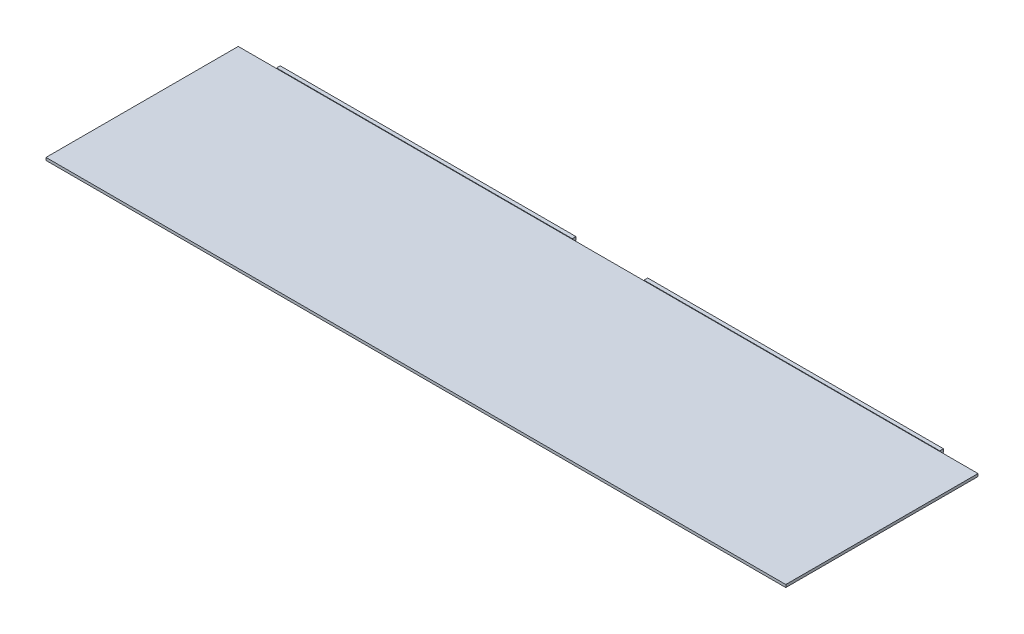
ISO-10303-21;
HEADER;
FILE_DESCRIPTION(('STEP AP214'),'2;1');
FILE_NAME('part.step','',(''),(''),'','','');
FILE_SCHEMA(('AUTOMOTIVE_DESIGN { 1 0 10303 214 1 1 1 1 }'));
ENDSEC;
DATA;
#1=APPLICATION_CONTEXT('core data for automotive mechanical design processes');
#2=APPLICATION_PROTOCOL_DEFINITION('international standard','automotive_design',2000,#1);
#3=PRODUCT_CONTEXT('',#1,'mechanical');
#4=PRODUCT('Part','Part','',(#3));
#5=PRODUCT_RELATED_PRODUCT_CATEGORY('part','',(#4));
#6=PRODUCT_DEFINITION_FORMATION('','',#4);
#7=PRODUCT_DEFINITION_CONTEXT('part definition',#1,'design');
#8=PRODUCT_DEFINITION('design','',#6,#7);
#9=PRODUCT_DEFINITION_SHAPE('','',#8);
#10=(LENGTH_UNIT() NAMED_UNIT(*) SI_UNIT(.MILLI.,.METRE.));
#11=(NAMED_UNIT(*) PLANE_ANGLE_UNIT() SI_UNIT($,.RADIAN.));
#12=(NAMED_UNIT(*) SI_UNIT($,.STERADIAN.) SOLID_ANGLE_UNIT());
#13=UNCERTAINTY_MEASURE_WITH_UNIT(LENGTH_MEASURE(1.E-05),#10,'distance_accuracy_value','');
#14=(GEOMETRIC_REPRESENTATION_CONTEXT(3) GLOBAL_UNCERTAINTY_ASSIGNED_CONTEXT((#13)) GLOBAL_UNIT_ASSIGNED_CONTEXT((#10,
#11,#12)) REPRESENTATION_CONTEXT('',''));
#15=CARTESIAN_POINT('',(0.,0.,0.));
#16=DIRECTION('',(0.,0.,1.));
#17=DIRECTION('',(1.,0.,0.));
#18=AXIS2_PLACEMENT_3D('',#15,#16,#17);
#19=CARTESIAN_POINT('',(-317.6778,1.143,-82.55));
#20=DIRECTION('',(0.,0.,1.));
#21=DIRECTION('',(1.,0.,0.));
#22=AXIS2_PLACEMENT_3D('',#19,#20,#21);
#23=PLANE('',#22);
#24=DIRECTION('',(0.,-1.,0.));
#25=VECTOR('',#24,1.);
#26=CARTESIAN_POINT('',(284.822900000001,-1.143,-82.55));
#27=LINE('',#26,#25);
#28=CARTESIAN_POINT('',(284.822900000001,1.143,-82.55));
#29=VERTEX_POINT('',#28);
#30=CARTESIAN_POINT('',(284.822900000001,-1.143,-82.55));
#31=VERTEX_POINT('',#30);
#32=EDGE_CURVE('E58',#29,#31,#27,.T.);
#33=ORIENTED_EDGE('',*,*,#32,.F.);
#34=DIRECTION('',(-1.,0.,0.));
#35=VECTOR('',#34,1.);
#36=CARTESIAN_POINT('',(-317.6778,1.143,-82.55));
#37=LINE('',#36,#35);
#38=CARTESIAN_POINT('',(317.6778,1.143,-82.55));
#39=VERTEX_POINT('',#38);
#40=EDGE_CURVE('E203',#39,#29,#37,.T.);
#41=ORIENTED_EDGE('',*,*,#40,.F.);
#42=DIRECTION('',(0.,-1.,0.));
#43=VECTOR('',#42,1.);
#44=CARTESIAN_POINT('',(317.6778,1.143,-82.55));
#45=LINE('',#44,#43);
#46=CARTESIAN_POINT('',(317.6778,-1.143,-82.55));
#47=VERTEX_POINT('',#46);
#48=EDGE_CURVE('E37',#39,#47,#45,.T.);
#49=ORIENTED_EDGE('',*,*,#48,.T.);
#50=DIRECTION('',(-1.,0.,0.));
#51=VECTOR('',#50,1.);
#52=CARTESIAN_POINT('',(-317.6778,-1.143,-82.55));
#53=LINE('',#52,#51);
#54=EDGE_CURVE('E214',#47,#31,#53,.T.);
#55=ORIENTED_EDGE('',*,*,#54,.T.);
#56=EDGE_LOOP('',(#33,#41,#49,#55));
#57=FACE_BOUND('',#56,.T.);
#58=ADVANCED_FACE('F33',(#57),#23,.F.);
#59=DIRECTION('',(0.,1.,0.));
#60=VECTOR('',#59,1.);
#61=CARTESIAN_POINT('',(30.8229000000015,1.58749999999994,-82.55));
#62=LINE('',#61,#60);
#63=CARTESIAN_POINT('',(30.8229000000015,-1.143,-82.55));
#64=VERTEX_POINT('',#63);
#65=CARTESIAN_POINT('',(30.8229000000014,1.143,-82.55));
#66=VERTEX_POINT('',#65);
#67=EDGE_CURVE('E252',#64,#66,#62,.T.);
#68=ORIENTED_EDGE('',*,*,#67,.F.);
#69=CARTESIAN_POINT('',(-30.8229000000015,-1.143,-82.55));
#70=VERTEX_POINT('',#69);
#71=EDGE_CURVE('E217',#64,#70,#53,.T.);
#72=ORIENTED_EDGE('',*,*,#71,.T.);
#73=DIRECTION('',(0.,-1.,0.));
#74=VECTOR('',#73,1.);
#75=CARTESIAN_POINT('',(-30.8229000000015,-1.143,-82.55));
#76=LINE('',#75,#74);
#77=CARTESIAN_POINT('',(-30.8229000000015,1.143,-82.55));
#78=VERTEX_POINT('',#77);
#79=EDGE_CURVE('E11',#78,#70,#76,.T.);
#80=ORIENTED_EDGE('',*,*,#79,.F.);
#81=EDGE_CURVE('E50',#66,#78,#37,.T.);
#82=ORIENTED_EDGE('',*,*,#81,.F.);
#83=EDGE_LOOP('',(#68,#72,#80,#82));
#84=FACE_BOUND('',#83,.T.);
#85=ADVANCED_FACE('F250',(#84),#23,.F.);
#86=DIRECTION('',(0.,1.,0.));
#87=VECTOR('',#86,1.);
#88=CARTESIAN_POINT('',(-284.822900000001,1.58749999999994,-82.55));
#89=LINE('',#88,#87);
#90=CARTESIAN_POINT('',(-284.822900000001,-1.143,-82.55));
#91=VERTEX_POINT('',#90);
#92=CARTESIAN_POINT('',(-284.822900000001,1.143,-82.55));
#93=VERTEX_POINT('',#92);
#94=EDGE_CURVE('E182',#91,#93,#89,.T.);
#95=ORIENTED_EDGE('',*,*,#94,.F.);
#96=CARTESIAN_POINT('',(-317.6778,-1.143,-82.55));
#97=VERTEX_POINT('',#96);
#98=EDGE_CURVE('E213',#91,#97,#53,.T.);
#99=ORIENTED_EDGE('',*,*,#98,.T.);
#100=DIRECTION('',(0.,-1.,0.));
#101=VECTOR('',#100,1.);
#102=CARTESIAN_POINT('',(-317.6778,1.143,-82.55));
#103=LINE('',#102,#101);
#104=CARTESIAN_POINT('',(-317.6778,1.143,-82.55));
#105=VERTEX_POINT('',#104);
#106=EDGE_CURVE('E224',#105,#97,#103,.T.);
#107=ORIENTED_EDGE('',*,*,#106,.F.);
#108=EDGE_CURVE('E201',#93,#105,#37,.T.);
#109=ORIENTED_EDGE('',*,*,#108,.F.);
#110=EDGE_LOOP('',(#95,#99,#107,#109));
#111=FACE_BOUND('',#110,.T.);
#112=ADVANCED_FACE('F248',(#111),#23,.F.);
#113=CARTESIAN_POINT('',(317.6778,1.143,-82.55));
#114=DIRECTION('',(-1.,0.,0.));
#115=DIRECTION('',(0.,0.,1.));
#116=AXIS2_PLACEMENT_3D('',#113,#114,#115);
#117=PLANE('',#116);
#118=DIRECTION('',(0.,0.,-1.));
#119=VECTOR('',#118,1.);
#120=CARTESIAN_POINT('',(317.6778,-1.143,-82.55));
#121=LINE('',#120,#119);
#122=CARTESIAN_POINT('',(317.6778,-1.143,82.55));
#123=VERTEX_POINT('',#122);
#124=EDGE_CURVE('E197',#123,#47,#121,.T.);
#125=ORIENTED_EDGE('',*,*,#124,.T.);
#126=ORIENTED_EDGE('',*,*,#48,.F.);
#127=DIRECTION('',(0.,0.,-1.));
#128=VECTOR('',#127,1.);
#129=CARTESIAN_POINT('',(317.6778,1.143,-82.55));
#130=LINE('',#129,#128);
#131=CARTESIAN_POINT('',(317.6778,1.143,82.55));
#132=VERTEX_POINT('',#131);
#133=EDGE_CURVE('E198',#132,#39,#130,.T.);
#134=ORIENTED_EDGE('',*,*,#133,.F.);
#135=DIRECTION('',(0.,-1.,0.));
#136=VECTOR('',#135,1.);
#137=CARTESIAN_POINT('',(317.6778,1.143,82.55));
#138=LINE('',#137,#136);
#139=EDGE_CURVE('E210',#132,#123,#138,.T.);
#140=ORIENTED_EDGE('',*,*,#139,.T.);
#141=EDGE_LOOP('',(#125,#126,#134,#140));
#142=FACE_BOUND('',#141,.T.);
#143=ADVANCED_FACE('F35',(#142),#117,.F.);
#144=CARTESIAN_POINT('',(-317.6778,1.143,-82.55));
#145=DIRECTION('',(1.,0.,0.));
#146=DIRECTION('',(0.,0.,-1.));
#147=AXIS2_PLACEMENT_3D('',#144,#145,#146);
#148=PLANE('',#147);
#149=DIRECTION('',(0.,0.,1.));
#150=VECTOR('',#149,1.);
#151=CARTESIAN_POINT('',(-317.6778,-1.143,-82.55));
#152=LINE('',#151,#150);
#153=CARTESIAN_POINT('',(-317.6778,-1.143,82.55));
#154=VERTEX_POINT('',#153);
#155=EDGE_CURVE('E216',#97,#154,#152,.T.);
#156=ORIENTED_EDGE('',*,*,#155,.T.);
#157=DIRECTION('',(0.,-1.,0.));
#158=VECTOR('',#157,1.);
#159=CARTESIAN_POINT('',(-317.6778,1.143,82.55));
#160=LINE('',#159,#158);
#161=CARTESIAN_POINT('',(-317.6778,1.143,82.55));
#162=VERTEX_POINT('',#161);
#163=EDGE_CURVE('E222',#162,#154,#160,.T.);
#164=ORIENTED_EDGE('',*,*,#163,.F.);
#165=DIRECTION('',(0.,0.,1.));
#166=VECTOR('',#165,1.);
#167=CARTESIAN_POINT('',(-317.6778,1.143,-82.55));
#168=LINE('',#167,#166);
#169=EDGE_CURVE('E205',#105,#162,#168,.T.);
#170=ORIENTED_EDGE('',*,*,#169,.F.);
#171=ORIENTED_EDGE('',*,*,#106,.T.);
#172=EDGE_LOOP('',(#156,#164,#170,#171));
#173=FACE_BOUND('',#172,.T.);
#174=ADVANCED_FACE('F241',(#173),#148,.F.);
#175=CARTESIAN_POINT('',(-317.6778,1.143,82.55));
#176=DIRECTION('',(0.,0.,-1.));
#177=DIRECTION('',(-1.,0.,0.));
#178=AXIS2_PLACEMENT_3D('',#175,#176,#177);
#179=PLANE('',#178);
#180=DIRECTION('',(1.,0.,0.));
#181=VECTOR('',#180,1.);
#182=CARTESIAN_POINT('',(-317.6778,-1.143,82.55));
#183=LINE('',#182,#181);
#184=EDGE_CURVE('E202',#154,#123,#183,.T.);
#185=ORIENTED_EDGE('',*,*,#184,.T.);
#186=ORIENTED_EDGE('',*,*,#139,.F.);
#187=DIRECTION('',(1.,0.,0.));
#188=VECTOR('',#187,1.);
#189=CARTESIAN_POINT('',(-317.6778,1.143,82.55));
#190=LINE('',#189,#188);
#191=EDGE_CURVE('E208',#162,#132,#190,.T.);
#192=ORIENTED_EDGE('',*,*,#191,.F.);
#193=ORIENTED_EDGE('',*,*,#163,.T.);
#194=EDGE_LOOP('',(#185,#186,#192,#193));
#195=FACE_BOUND('',#194,.T.);
#196=ADVANCED_FACE('F238',(#195),#179,.F.);
#197=CARTESIAN_POINT('',(0.,1.143,0.));
#198=DIRECTION('',(0.,1.,0.));
#199=DIRECTION('',(0.,0.,1.));
#200=AXIS2_PLACEMENT_3D('',#197,#198,#199);
#201=PLANE('',#200);
#202=ORIENTED_EDGE('',*,*,#133,.T.);
#203=ORIENTED_EDGE('',*,*,#40,.T.);
#204=DIRECTION('',(1.,0.,0.));
#205=VECTOR('',#204,1.);
#206=CARTESIAN_POINT('',(0.,1.143,-82.55));
#207=LINE('',#206,#205);
#208=EDGE_CURVE('E161',#66,#29,#207,.T.);
#209=ORIENTED_EDGE('',*,*,#208,.F.);
#210=ORIENTED_EDGE('',*,*,#81,.T.);
#211=EDGE_CURVE('E206',#78,#93,#37,.T.);
#212=ORIENTED_EDGE('',*,*,#211,.T.);
#213=ORIENTED_EDGE('',*,*,#108,.T.);
#214=ORIENTED_EDGE('',*,*,#169,.T.);
#215=ORIENTED_EDGE('',*,*,#191,.T.);
#216=EDGE_LOOP('',(#202,#203,#209,#210,#212,#213,#214,#215));
#217=FACE_BOUND('',#216,.T.);
#218=ADVANCED_FACE('F243',(#217),#201,.T.);
#219=CARTESIAN_POINT('',(0.,-1.143,0.));
#220=DIRECTION('',(0.,1.,0.));
#221=DIRECTION('',(0.,0.,1.));
#222=AXIS2_PLACEMENT_3D('',#219,#220,#221);
#223=PLANE('',#222);
#224=ORIENTED_EDGE('',*,*,#124,.F.);
#225=ORIENTED_EDGE('',*,*,#184,.F.);
#226=ORIENTED_EDGE('',*,*,#155,.F.);
#227=ORIENTED_EDGE('',*,*,#98,.F.);
#228=DIRECTION('',(0.,0.,1.));
#229=VECTOR('',#228,1.);
#230=CARTESIAN_POINT('',(-284.822900000001,-1.143,-85.725));
#231=LINE('',#230,#229);
#232=CARTESIAN_POINT('',(-284.822900000001,-1.143,-85.725));
#233=VERTEX_POINT('',#232);
#234=EDGE_CURVE('E191',#233,#91,#231,.T.);
#235=ORIENTED_EDGE('',*,*,#234,.F.);
#236=DIRECTION('',(-1.,0.,0.));
#237=VECTOR('',#236,1.);
#238=CARTESIAN_POINT('',(-30.8229000000015,-1.143,-85.725));
#239=LINE('',#238,#237);
#240=CARTESIAN_POINT('',(-30.8229000000015,-1.143,-85.725));
#241=VERTEX_POINT('',#240);
#242=EDGE_CURVE('E172',#241,#233,#239,.T.);
#243=ORIENTED_EDGE('',*,*,#242,.F.);
#244=DIRECTION('',(0.,0.,1.));
#245=VECTOR('',#244,1.);
#246=CARTESIAN_POINT('',(-30.8229000000015,-1.143,-85.725));
#247=LINE('',#246,#245);
#248=EDGE_CURVE('E194',#241,#70,#247,.T.);
#249=ORIENTED_EDGE('',*,*,#248,.T.);
#250=ORIENTED_EDGE('',*,*,#71,.F.);
#251=DIRECTION('',(0.,0.,1.));
#252=VECTOR('',#251,1.);
#253=CARTESIAN_POINT('',(30.8229000000015,-1.143,-85.725));
#254=LINE('',#253,#252);
#255=CARTESIAN_POINT('',(30.8229000000015,-1.143,-85.725));
#256=VERTEX_POINT('',#255);
#257=EDGE_CURVE('E144',#256,#64,#254,.T.);
#258=ORIENTED_EDGE('',*,*,#257,.F.);
#259=DIRECTION('',(-1.,0.,0.));
#260=VECTOR('',#259,1.);
#261=CARTESIAN_POINT('',(284.822900000001,-1.143,-85.725));
#262=LINE('',#261,#260);
#263=CARTESIAN_POINT('',(284.822900000001,-1.143,-85.725));
#264=VERTEX_POINT('',#263);
#265=EDGE_CURVE('E137',#264,#256,#262,.T.);
#266=ORIENTED_EDGE('',*,*,#265,.F.);
#267=DIRECTION('',(0.,0.,1.));
#268=VECTOR('',#267,1.);
#269=CARTESIAN_POINT('',(284.822900000001,-1.143,-85.725));
#270=LINE('',#269,#268);
#271=EDGE_CURVE('E142',#264,#31,#270,.T.);
#272=ORIENTED_EDGE('',*,*,#271,.T.);
#273=ORIENTED_EDGE('',*,*,#54,.F.);
#274=EDGE_LOOP('',(#224,#225,#226,#227,#235,#243,#249,#250,#258,#266,#272,#273));
#275=FACE_BOUND('',#274,.T.);
#276=ADVANCED_FACE('F140',(#275),#223,.F.);
#277=CARTESIAN_POINT('',(0.,0.,-82.55));
#278=DIRECTION('',(0.,0.,1.));
#279=DIRECTION('',(1.,0.,0.));
#280=AXIS2_PLACEMENT_3D('',#277,#278,#279);
#281=PLANE('',#280);
#282=ORIENTED_EDGE('',*,*,#211,.F.);
#283=CARTESIAN_POINT('',(-30.8229000000015,1.58749999999994,-82.55));
#284=VERTEX_POINT('',#283);
#285=EDGE_CURVE('E43',#284,#78,#76,.T.);
#286=ORIENTED_EDGE('',*,*,#285,.F.);
#287=DIRECTION('',(1.,0.,0.));
#288=VECTOR('',#287,1.);
#289=CARTESIAN_POINT('',(-30.8229000000015,1.58749999999994,-82.55));
#290=LINE('',#289,#288);
#291=CARTESIAN_POINT('',(-284.822900000001,1.58749999999994,-82.55));
#292=VERTEX_POINT('',#291);
#293=EDGE_CURVE('E173',#292,#284,#290,.T.);
#294=ORIENTED_EDGE('',*,*,#293,.F.);
#295=EDGE_CURVE('E181',#93,#292,#89,.T.);
#296=ORIENTED_EDGE('',*,*,#295,.F.);
#297=EDGE_LOOP('',(#282,#286,#294,#296));
#298=FACE_BOUND('',#297,.T.);
#299=ADVANCED_FACE('F266',(#298),#281,.T.);
#300=CARTESIAN_POINT('',(-30.8229000000015,-1.143,-85.725));
#301=DIRECTION('',(-1.,0.,0.));
#302=DIRECTION('',(0.,0.,1.));
#303=AXIS2_PLACEMENT_3D('',#300,#301,#302);
#304=PLANE('',#303);
#305=ORIENTED_EDGE('',*,*,#285,.T.);
#306=ORIENTED_EDGE('',*,*,#79,.T.);
#307=ORIENTED_EDGE('',*,*,#248,.F.);
#308=DIRECTION('',(0.,-1.,0.));
#309=VECTOR('',#308,1.);
#310=CARTESIAN_POINT('',(-30.8229000000015,-1.143,-85.725));
#311=LINE('',#310,#309);
#312=CARTESIAN_POINT('',(-30.8229000000015,1.58749999999994,-85.725));
#313=VERTEX_POINT('',#312);
#314=EDGE_CURVE('E169',#313,#241,#311,.T.);
#315=ORIENTED_EDGE('',*,*,#314,.F.);
#316=DIRECTION('',(0.,0.,1.));
#317=VECTOR('',#316,1.);
#318=CARTESIAN_POINT('',(-30.8229000000015,1.58749999999994,-85.725));
#319=LINE('',#318,#317);
#320=EDGE_CURVE('E178',#313,#284,#319,.T.);
#321=ORIENTED_EDGE('',*,*,#320,.T.);
#322=EDGE_LOOP('',(#305,#306,#307,#315,#321));
#323=FACE_BOUND('',#322,.T.);
#324=ADVANCED_FACE('F255',(#323),#304,.F.);
#325=CARTESIAN_POINT('',(-284.822900000001,1.58749999999994,-85.725));
#326=DIRECTION('',(1.,0.,0.));
#327=DIRECTION('',(0.,1.,0.));
#328=AXIS2_PLACEMENT_3D('',#325,#326,#327);
#329=PLANE('',#328);
#330=ORIENTED_EDGE('',*,*,#94,.T.);
#331=ORIENTED_EDGE('',*,*,#295,.T.);
#332=DIRECTION('',(0.,0.,1.));
#333=VECTOR('',#332,1.);
#334=CARTESIAN_POINT('',(-284.822900000001,1.58749999999994,-85.725));
#335=LINE('',#334,#333);
#336=CARTESIAN_POINT('',(-284.822900000001,1.58749999999994,-85.725));
#337=VERTEX_POINT('',#336);
#338=EDGE_CURVE('E188',#337,#292,#335,.T.);
#339=ORIENTED_EDGE('',*,*,#338,.F.);
#340=DIRECTION('',(0.,1.,0.));
#341=VECTOR('',#340,1.);
#342=CARTESIAN_POINT('',(-284.822900000001,1.58749999999994,-85.725));
#343=LINE('',#342,#341);
#344=EDGE_CURVE('E175',#233,#337,#343,.T.);
#345=ORIENTED_EDGE('',*,*,#344,.F.);
#346=ORIENTED_EDGE('',*,*,#234,.T.);
#347=EDGE_LOOP('',(#330,#331,#339,#345,#346));
#348=FACE_BOUND('',#347,.T.);
#349=ADVANCED_FACE('F319',(#348),#329,.F.);
#350=CARTESIAN_POINT('',(-30.8229000000015,1.58749999999994,-85.725));
#351=DIRECTION('',(0.,-1.,0.));
#352=DIRECTION('',(0.,0.,-1.));
#353=AXIS2_PLACEMENT_3D('',#350,#351,#352);
#354=PLANE('',#353);
#355=ORIENTED_EDGE('',*,*,#293,.T.);
#356=ORIENTED_EDGE('',*,*,#320,.F.);
#357=DIRECTION('',(1.,0.,0.));
#358=VECTOR('',#357,1.);
#359=CARTESIAN_POINT('',(-30.8229000000015,1.58749999999994,-85.725));
#360=LINE('',#359,#358);
#361=EDGE_CURVE('E177',#337,#313,#360,.T.);
#362=ORIENTED_EDGE('',*,*,#361,.F.);
#363=ORIENTED_EDGE('',*,*,#338,.T.);
#364=EDGE_LOOP('',(#355,#356,#362,#363));
#365=FACE_BOUND('',#364,.T.);
#366=ADVANCED_FACE('F322',(#365),#354,.F.);
#367=CARTESIAN_POINT('',(0.,0.,-85.725));
#368=DIRECTION('',(0.,0.,1.));
#369=DIRECTION('',(1.,0.,0.));
#370=AXIS2_PLACEMENT_3D('',#367,#368,#369);
#371=PLANE('',#370);
#372=ORIENTED_EDGE('',*,*,#314,.T.);
#373=ORIENTED_EDGE('',*,*,#242,.T.);
#374=ORIENTED_EDGE('',*,*,#344,.T.);
#375=ORIENTED_EDGE('',*,*,#361,.T.);
#376=EDGE_LOOP('',(#372,#373,#374,#375));
#377=FACE_BOUND('',#376,.T.);
#378=ADVANCED_FACE('F260',(#377),#371,.F.);
#379=CARTESIAN_POINT('',(284.822900000001,-1.143,-85.725));
#380=DIRECTION('',(-1.,0.,0.));
#381=DIRECTION('',(0.,-1.,0.));
#382=AXIS2_PLACEMENT_3D('',#379,#380,#381);
#383=PLANE('',#382);
#384=CARTESIAN_POINT('',(284.822900000001,1.58749999999994,-82.55));
#385=VERTEX_POINT('',#384);
#386=EDGE_CURVE('E276',#385,#29,#27,.T.);
#387=ORIENTED_EDGE('',*,*,#386,.T.);
#388=ORIENTED_EDGE('',*,*,#32,.T.);
#389=ORIENTED_EDGE('',*,*,#271,.F.);
#390=DIRECTION('',(0.,-1.,0.));
#391=VECTOR('',#390,1.);
#392=CARTESIAN_POINT('',(284.822900000001,-1.143,-85.725));
#393=LINE('',#392,#391);
#394=CARTESIAN_POINT('',(284.822900000001,1.58749999999994,-85.725));
#395=VERTEX_POINT('',#394);
#396=EDGE_CURVE('E148',#395,#264,#393,.T.);
#397=ORIENTED_EDGE('',*,*,#396,.F.);
#398=DIRECTION('',(0.,0.,1.));
#399=VECTOR('',#398,1.);
#400=CARTESIAN_POINT('',(284.822900000001,1.58749999999994,-85.725));
#401=LINE('',#400,#399);
#402=EDGE_CURVE('E283',#395,#385,#401,.T.);
#403=ORIENTED_EDGE('',*,*,#402,.T.);
#404=EDGE_LOOP('',(#387,#388,#389,#397,#403));
#405=FACE_BOUND('',#404,.T.);
#406=ADVANCED_FACE('F160',(#405),#383,.F.);
#407=CARTESIAN_POINT('',(30.8229000000015,1.58749999999994,-85.725));
#408=DIRECTION('',(1.,0.,0.));
#409=DIRECTION('',(0.,0.,-1.));
#410=AXIS2_PLACEMENT_3D('',#407,#408,#409);
#411=PLANE('',#410);
#412=ORIENTED_EDGE('',*,*,#67,.T.);
#413=CARTESIAN_POINT('',(30.8229000000015,1.58749999999994,-82.55));
#414=VERTEX_POINT('',#413);
#415=EDGE_CURVE('E271',#66,#414,#62,.T.);
#416=ORIENTED_EDGE('',*,*,#415,.T.);
#417=DIRECTION('',(0.,0.,1.));
#418=VECTOR('',#417,1.);
#419=CARTESIAN_POINT('',(30.8229000000015,1.58749999999994,-85.725));
#420=LINE('',#419,#418);
#421=CARTESIAN_POINT('',(30.8229000000015,1.58749999999994,-85.725));
#422=VERTEX_POINT('',#421);
#423=EDGE_CURVE('E165',#422,#414,#420,.T.);
#424=ORIENTED_EDGE('',*,*,#423,.F.);
#425=DIRECTION('',(0.,1.,0.));
#426=VECTOR('',#425,1.);
#427=CARTESIAN_POINT('',(30.8229000000015,1.58749999999994,-85.725));
#428=LINE('',#427,#426);
#429=EDGE_CURVE('E147',#256,#422,#428,.T.);
#430=ORIENTED_EDGE('',*,*,#429,.F.);
#431=ORIENTED_EDGE('',*,*,#257,.T.);
#432=EDGE_LOOP('',(#412,#416,#424,#430,#431));
#433=FACE_BOUND('',#432,.T.);
#434=ADVANCED_FACE('F278',(#433),#411,.F.);
#435=CARTESIAN_POINT('',(284.822900000001,1.58749999999994,-85.725));
#436=DIRECTION('',(0.,-1.,0.));
#437=DIRECTION('',(0.,0.,-1.));
#438=AXIS2_PLACEMENT_3D('',#435,#436,#437);
#439=PLANE('',#438);
#440=DIRECTION('',(1.,0.,0.));
#441=VECTOR('',#440,1.);
#442=CARTESIAN_POINT('',(284.822900000001,1.58749999999994,-82.55));
#443=LINE('',#442,#441);
#444=EDGE_CURVE('E157',#414,#385,#443,.T.);
#445=ORIENTED_EDGE('',*,*,#444,.T.);
#446=ORIENTED_EDGE('',*,*,#402,.F.);
#447=DIRECTION('',(1.,0.,0.));
#448=VECTOR('',#447,1.);
#449=CARTESIAN_POINT('',(284.822900000001,1.58749999999994,-85.725));
#450=LINE('',#449,#448);
#451=EDGE_CURVE('E153',#422,#395,#450,.T.);
#452=ORIENTED_EDGE('',*,*,#451,.F.);
#453=ORIENTED_EDGE('',*,*,#423,.T.);
#454=EDGE_LOOP('',(#445,#446,#452,#453));
#455=FACE_BOUND('',#454,.T.);
#456=ADVANCED_FACE('F285',(#455),#439,.F.);
#457=CARTESIAN_POINT('',(0.,0.,-85.725));
#458=DIRECTION('',(0.,0.,1.));
#459=DIRECTION('',(1.,0.,0.));
#460=AXIS2_PLACEMENT_3D('',#457,#458,#459);
#461=PLANE('',#460);
#462=ORIENTED_EDGE('',*,*,#396,.T.);
#463=ORIENTED_EDGE('',*,*,#265,.T.);
#464=ORIENTED_EDGE('',*,*,#429,.T.);
#465=ORIENTED_EDGE('',*,*,#451,.T.);
#466=EDGE_LOOP('',(#462,#463,#464,#465));
#467=FACE_BOUND('',#466,.T.);
#468=ADVANCED_FACE('F151',(#467),#461,.F.);
#469=CARTESIAN_POINT('',(0.,0.,-82.55));
#470=DIRECTION('',(0.,0.,1.));
#471=DIRECTION('',(1.,0.,0.));
#472=AXIS2_PLACEMENT_3D('',#469,#470,#471);
#473=PLANE('',#472);
#474=ORIENTED_EDGE('',*,*,#415,.F.);
#475=ORIENTED_EDGE('',*,*,#208,.T.);
#476=ORIENTED_EDGE('',*,*,#386,.F.);
#477=ORIENTED_EDGE('',*,*,#444,.F.);
#478=EDGE_LOOP('',(#474,#475,#476,#477));
#479=FACE_BOUND('',#478,.T.);
#480=ADVANCED_FACE('F272',(#479),#473,.T.);
#481=CLOSED_SHELL('',(#58,#85,#112,#143,#174,#196,#218,#276,#299,#324,#349,#366,#378,#406,#434,
#456,#468,#480));
#482=MANIFOLD_SOLID_BREP('B2',#481);
#483=ADVANCED_BREP_SHAPE_REPRESENTATION('',(#18,#482),#14);
#484=SHAPE_DEFINITION_REPRESENTATION(#9,#483);
ENDSEC;
END-ISO-10303-21;
